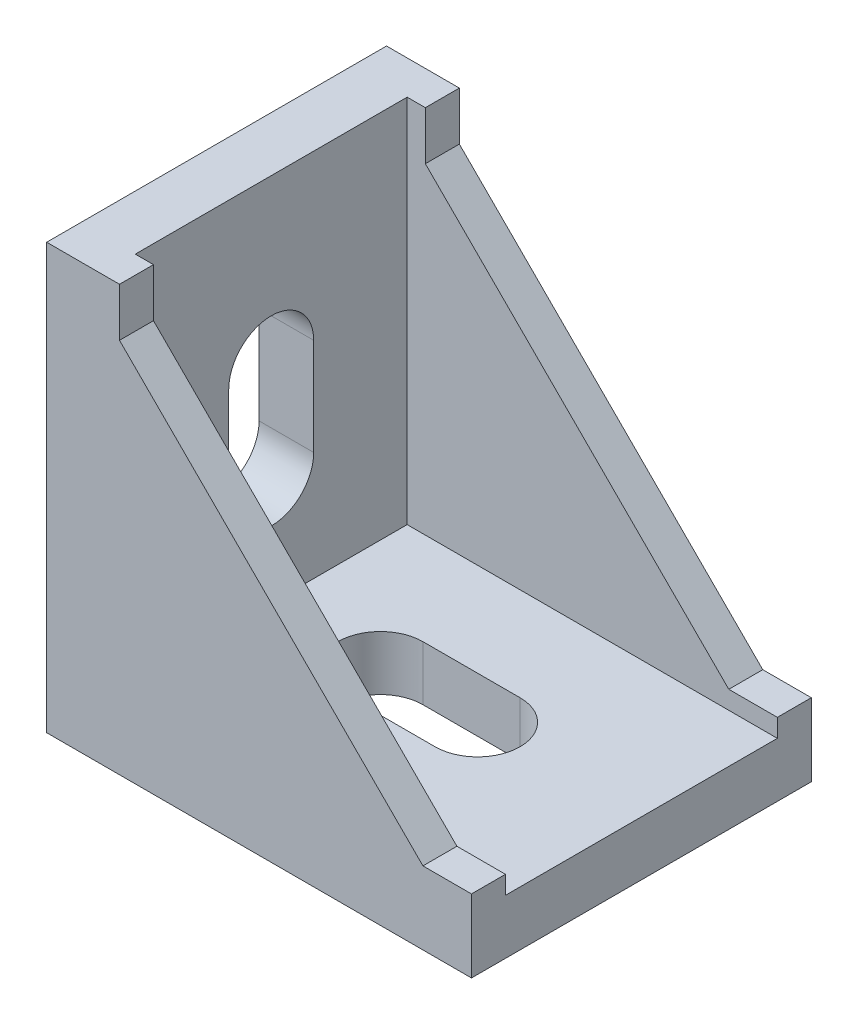
ISO-10303-21;
HEADER;
FILE_DESCRIPTION(('STEP AP214'),'2;1');
FILE_NAME('part.step','',(''),(''),'','','');
FILE_SCHEMA(('AUTOMOTIVE_DESIGN { 1 0 10303 214 1 1 1 1 }'));
ENDSEC;
DATA;
#1=APPLICATION_CONTEXT('core data for automotive mechanical design processes');
#2=APPLICATION_PROTOCOL_DEFINITION('international standard','automotive_design',2000,#1);
#3=PRODUCT_CONTEXT('',#1,'mechanical');
#4=PRODUCT('Part','Part','',(#3));
#5=PRODUCT_RELATED_PRODUCT_CATEGORY('part','',(#4));
#6=PRODUCT_DEFINITION_FORMATION('','',#4);
#7=PRODUCT_DEFINITION_CONTEXT('part definition',#1,'design');
#8=PRODUCT_DEFINITION('design','',#6,#7);
#9=PRODUCT_DEFINITION_SHAPE('','',#8);
#10=(LENGTH_UNIT() NAMED_UNIT(*) SI_UNIT(.MILLI.,.METRE.));
#11=(NAMED_UNIT(*) PLANE_ANGLE_UNIT() SI_UNIT($,.RADIAN.));
#12=(NAMED_UNIT(*) SI_UNIT($,.STERADIAN.) SOLID_ANGLE_UNIT());
#13=UNCERTAINTY_MEASURE_WITH_UNIT(LENGTH_MEASURE(1.E-05),#10,'distance_accuracy_value','');
#14=(GEOMETRIC_REPRESENTATION_CONTEXT(3) GLOBAL_UNCERTAINTY_ASSIGNED_CONTEXT((#13)) GLOBAL_UNIT_ASSIGNED_CONTEXT((#10,
#11,#12)) REPRESENTATION_CONTEXT('',''));
#15=CARTESIAN_POINT('',(0.,0.,0.));
#16=DIRECTION('',(0.,0.,1.));
#17=DIRECTION('',(1.,0.,0.));
#18=AXIS2_PLACEMENT_3D('',#15,#16,#17);
#19=CARTESIAN_POINT('',(13.5,0.,0.));
#20=DIRECTION('',(0.,1.,0.));
#21=DIRECTION('',(0.,0.,1.));
#22=AXIS2_PLACEMENT_3D('',#19,#20,#21);
#23=CYLINDRICAL_SURFACE('',#22,3.5);
#24=CARTESIAN_POINT('',(13.5,4.5,0.));
#25=DIRECTION('',(0.,-1.,0.));
#26=DIRECTION('',(0.,0.,1.));
#27=AXIS2_PLACEMENT_3D('',#24,#25,#26);
#28=CIRCLE('',#27,3.5);
#29=CARTESIAN_POINT('',(13.5,4.5,3.5));
#30=VERTEX_POINT('',#29);
#31=CARTESIAN_POINT('',(13.5,4.5,-3.5));
#32=VERTEX_POINT('',#31);
#33=EDGE_CURVE('E35',#30,#32,#28,.T.);
#34=ORIENTED_EDGE('',*,*,#33,.F.);
#35=DIRECTION('',(0.,1.,0.));
#36=VECTOR('',#35,1.);
#37=CARTESIAN_POINT('',(13.5,0.,3.5));
#38=LINE('',#37,#36);
#39=CARTESIAN_POINT('',(13.5,0.,3.5));
#40=VERTEX_POINT('',#39);
#41=EDGE_CURVE('E410',#40,#30,#38,.T.);
#42=ORIENTED_EDGE('',*,*,#41,.F.);
#43=CARTESIAN_POINT('',(13.5,0.,0.));
#44=DIRECTION('',(0.,1.,0.));
#45=DIRECTION('',(0.,0.,1.));
#46=AXIS2_PLACEMENT_3D('',#43,#44,#45);
#47=CIRCLE('',#46,3.5);
#48=CARTESIAN_POINT('',(13.5,0.,-3.5));
#49=VERTEX_POINT('',#48);
#50=EDGE_CURVE('E419',#49,#40,#47,.T.);
#51=ORIENTED_EDGE('',*,*,#50,.F.);
#52=DIRECTION('',(0.,1.,0.));
#53=VECTOR('',#52,1.);
#54=CARTESIAN_POINT('',(13.5,0.,-3.5));
#55=LINE('',#54,#53);
#56=EDGE_CURVE('E11',#49,#32,#55,.T.);
#57=ORIENTED_EDGE('',*,*,#56,.T.);
#58=EDGE_LOOP('',(#34,#42,#51,#57));
#59=FACE_BOUND('',#58,.T.);
#60=ADVANCED_FACE('F17',(#59),#23,.F.);
#61=CARTESIAN_POINT('',(21.5,0.,-3.5));
#62=DIRECTION('',(0.,0.,-1.));
#63=DIRECTION('',(0.707106781186548,0.707106781186548,0.));
#64=AXIS2_PLACEMENT_3D('',#61,#62,#63);
#65=PLANE('',#64);
#66=DIRECTION('',(1.,0.,0.));
#67=VECTOR('',#66,1.);
#68=CARTESIAN_POINT('',(28.25,4.5,-3.5));
#69=LINE('',#68,#67);
#70=CARTESIAN_POINT('',(21.5,4.5,-3.5));
#71=VERTEX_POINT('',#70);
#72=EDGE_CURVE('E305',#32,#71,#69,.T.);
#73=ORIENTED_EDGE('',*,*,#72,.F.);
#74=ORIENTED_EDGE('',*,*,#56,.F.);
#75=DIRECTION('',(-1.,0.,0.));
#76=VECTOR('',#75,1.);
#77=CARTESIAN_POINT('',(10.75,0.,-3.5));
#78=LINE('',#77,#76);
#79=CARTESIAN_POINT('',(21.5,0.,-3.5));
#80=VERTEX_POINT('',#79);
#81=EDGE_CURVE('E428',#80,#49,#78,.T.);
#82=ORIENTED_EDGE('',*,*,#81,.F.);
#83=DIRECTION('',(0.,1.,0.));
#84=VECTOR('',#83,1.);
#85=CARTESIAN_POINT('',(21.5,0.,-3.5));
#86=LINE('',#85,#84);
#87=EDGE_CURVE('E27',#80,#71,#86,.T.);
#88=ORIENTED_EDGE('',*,*,#87,.T.);
#89=EDGE_LOOP('',(#73,#74,#82,#88));
#90=FACE_BOUND('',#89,.T.);
#91=ADVANCED_FACE('F366',(#90),#65,.F.);
#92=CARTESIAN_POINT('',(21.5,0.,0.));
#93=DIRECTION('',(0.,1.,0.));
#94=DIRECTION('',(0.,0.,-1.));
#95=AXIS2_PLACEMENT_3D('',#92,#93,#94);
#96=CYLINDRICAL_SURFACE('',#95,3.5);
#97=CARTESIAN_POINT('',(21.5,4.5,0.));
#98=DIRECTION('',(0.,-1.,0.));
#99=DIRECTION('',(0.,0.,-1.));
#100=AXIS2_PLACEMENT_3D('',#97,#98,#99);
#101=CIRCLE('',#100,3.5);
#102=CARTESIAN_POINT('',(21.5,4.5,3.5));
#103=VERTEX_POINT('',#102);
#104=EDGE_CURVE('E293',#71,#103,#101,.T.);
#105=ORIENTED_EDGE('',*,*,#104,.F.);
#106=ORIENTED_EDGE('',*,*,#87,.F.);
#107=CARTESIAN_POINT('',(21.5,0.,0.));
#108=DIRECTION('',(0.,1.,0.));
#109=DIRECTION('',(0.,0.,-1.));
#110=AXIS2_PLACEMENT_3D('',#107,#108,#109);
#111=CIRCLE('',#110,3.5);
#112=CARTESIAN_POINT('',(21.5,0.,3.5));
#113=VERTEX_POINT('',#112);
#114=EDGE_CURVE('E295',#113,#80,#111,.T.);
#115=ORIENTED_EDGE('',*,*,#114,.F.);
#116=DIRECTION('',(0.,1.,0.));
#117=VECTOR('',#116,1.);
#118=CARTESIAN_POINT('',(21.5,0.,3.5));
#119=LINE('',#118,#117);
#120=EDGE_CURVE('E423',#113,#103,#119,.T.);
#121=ORIENTED_EDGE('',*,*,#120,.T.);
#122=EDGE_LOOP('',(#105,#106,#115,#121));
#123=FACE_BOUND('',#122,.T.);
#124=ADVANCED_FACE('F371',(#123),#96,.F.);
#125=CARTESIAN_POINT('',(13.5,0.,3.5));
#126=DIRECTION('',(0.,0.,1.));
#127=DIRECTION('',(0.707106781186548,0.707106781186548,0.));
#128=AXIS2_PLACEMENT_3D('',#125,#126,#127);
#129=PLANE('',#128);
#130=DIRECTION('',(-1.,0.,0.));
#131=VECTOR('',#130,1.);
#132=CARTESIAN_POINT('',(24.25,4.5,3.5));
#133=LINE('',#132,#131);
#134=EDGE_CURVE('E420',#103,#30,#133,.T.);
#135=ORIENTED_EDGE('',*,*,#134,.F.);
#136=ORIENTED_EDGE('',*,*,#120,.F.);
#137=DIRECTION('',(1.,0.,0.));
#138=VECTOR('',#137,1.);
#139=CARTESIAN_POINT('',(6.75,0.,3.5));
#140=LINE('',#139,#138);
#141=EDGE_CURVE('E189',#40,#113,#140,.T.);
#142=ORIENTED_EDGE('',*,*,#141,.F.);
#143=ORIENTED_EDGE('',*,*,#41,.T.);
#144=EDGE_LOOP('',(#135,#136,#142,#143));
#145=FACE_BOUND('',#144,.T.);
#146=ADVANCED_FACE('F377',(#145),#129,.F.);
#147=CARTESIAN_POINT('',(0.,21.5,0.));
#148=DIRECTION('',(1.,0.,0.));
#149=DIRECTION('',(0.,0.,1.));
#150=AXIS2_PLACEMENT_3D('',#147,#148,#149);
#151=CYLINDRICAL_SURFACE('',#150,3.5);
#152=CARTESIAN_POINT('',(4.5,21.5,0.));
#153=DIRECTION('',(-1.,0.,0.));
#154=DIRECTION('',(0.,0.,1.));
#155=AXIS2_PLACEMENT_3D('',#152,#153,#154);
#156=CIRCLE('',#155,3.5);
#157=CARTESIAN_POINT('',(4.5,21.5,3.5));
#158=VERTEX_POINT('',#157);
#159=CARTESIAN_POINT('',(4.5,21.5,-3.5));
#160=VERTEX_POINT('',#159);
#161=EDGE_CURVE('E261',#158,#160,#156,.T.);
#162=ORIENTED_EDGE('',*,*,#161,.F.);
#163=DIRECTION('',(1.,0.,0.));
#164=VECTOR('',#163,1.);
#165=CARTESIAN_POINT('',(0.,21.5,3.5));
#166=LINE('',#165,#164);
#167=CARTESIAN_POINT('',(0.,21.5,3.5));
#168=VERTEX_POINT('',#167);
#169=EDGE_CURVE('E257',#168,#158,#166,.T.);
#170=ORIENTED_EDGE('',*,*,#169,.F.);
#171=CARTESIAN_POINT('',(0.,21.5,0.));
#172=DIRECTION('',(1.,0.,0.));
#173=DIRECTION('',(0.,0.,1.));
#174=AXIS2_PLACEMENT_3D('',#171,#172,#173);
#175=CIRCLE('',#174,3.5);
#176=CARTESIAN_POINT('',(0.,21.5,-3.5));
#177=VERTEX_POINT('',#176);
#178=EDGE_CURVE('E247',#177,#168,#175,.T.);
#179=ORIENTED_EDGE('',*,*,#178,.F.);
#180=DIRECTION('',(1.,0.,0.));
#181=VECTOR('',#180,1.);
#182=CARTESIAN_POINT('',(0.,21.5,-3.5));
#183=LINE('',#182,#181);
#184=EDGE_CURVE('E409',#177,#160,#183,.T.);
#185=ORIENTED_EDGE('',*,*,#184,.T.);
#186=EDGE_LOOP('',(#162,#170,#179,#185));
#187=FACE_BOUND('',#186,.T.);
#188=ADVANCED_FACE('F381',(#187),#151,.F.);
#189=CARTESIAN_POINT('',(0.,13.5,-3.5));
#190=DIRECTION('',(0.,0.,-1.));
#191=DIRECTION('',(0.707106781186548,0.707106781186548,0.));
#192=AXIS2_PLACEMENT_3D('',#189,#190,#191);
#193=PLANE('',#192);
#194=DIRECTION('',(0.,-1.,0.));
#195=VECTOR('',#194,1.);
#196=CARTESIAN_POINT('',(4.5,9.,-3.5));
#197=LINE('',#196,#195);
#198=CARTESIAN_POINT('',(4.5,13.5,-3.5));
#199=VERTEX_POINT('',#198);
#200=EDGE_CURVE('E301',#160,#199,#197,.T.);
#201=ORIENTED_EDGE('',*,*,#200,.F.);
#202=ORIENTED_EDGE('',*,*,#184,.F.);
#203=DIRECTION('',(0.,1.,0.));
#204=VECTOR('',#203,1.);
#205=CARTESIAN_POINT('',(0.,24.25,-3.5));
#206=LINE('',#205,#204);
#207=CARTESIAN_POINT('',(0.,13.5,-3.5));
#208=VERTEX_POINT('',#207);
#209=EDGE_CURVE('E242',#208,#177,#206,.T.);
#210=ORIENTED_EDGE('',*,*,#209,.F.);
#211=DIRECTION('',(1.,0.,0.));
#212=VECTOR('',#211,1.);
#213=CARTESIAN_POINT('',(0.,13.5,-3.5));
#214=LINE('',#213,#212);
#215=EDGE_CURVE('E256',#208,#199,#214,.T.);
#216=ORIENTED_EDGE('',*,*,#215,.T.);
#217=EDGE_LOOP('',(#201,#202,#210,#216));
#218=FACE_BOUND('',#217,.T.);
#219=ADVANCED_FACE('F385',(#218),#193,.F.);
#220=CARTESIAN_POINT('',(0.,13.5,0.));
#221=DIRECTION('',(1.,0.,0.));
#222=DIRECTION('',(0.,0.,-1.));
#223=AXIS2_PLACEMENT_3D('',#220,#221,#222);
#224=CYLINDRICAL_SURFACE('',#223,3.5);
#225=CARTESIAN_POINT('',(4.5,13.5,0.));
#226=DIRECTION('',(-1.,0.,0.));
#227=DIRECTION('',(0.,0.,-1.));
#228=AXIS2_PLACEMENT_3D('',#225,#226,#227);
#229=CIRCLE('',#228,3.5);
#230=CARTESIAN_POINT('',(4.5,13.5,3.5));
#231=VERTEX_POINT('',#230);
#232=EDGE_CURVE('E251',#199,#231,#229,.T.);
#233=ORIENTED_EDGE('',*,*,#232,.F.);
#234=ORIENTED_EDGE('',*,*,#215,.F.);
#235=CARTESIAN_POINT('',(0.,13.5,0.));
#236=DIRECTION('',(1.,0.,0.));
#237=DIRECTION('',(0.,0.,-1.));
#238=AXIS2_PLACEMENT_3D('',#235,#236,#237);
#239=CIRCLE('',#238,3.5);
#240=CARTESIAN_POINT('',(0.,13.5,3.5));
#241=VERTEX_POINT('',#240);
#242=EDGE_CURVE('E238',#241,#208,#239,.T.);
#243=ORIENTED_EDGE('',*,*,#242,.F.);
#244=DIRECTION('',(1.,0.,0.));
#245=VECTOR('',#244,1.);
#246=CARTESIAN_POINT('',(0.,13.5,3.5));
#247=LINE('',#246,#245);
#248=EDGE_CURVE('E253',#241,#231,#247,.T.);
#249=ORIENTED_EDGE('',*,*,#248,.T.);
#250=EDGE_LOOP('',(#233,#234,#243,#249));
#251=FACE_BOUND('',#250,.T.);
#252=ADVANCED_FACE('F389',(#251),#224,.F.);
#253=CARTESIAN_POINT('',(0.,21.5,3.5));
#254=DIRECTION('',(0.,0.,1.));
#255=DIRECTION('',(0.707106781186548,0.707106781186548,0.));
#256=AXIS2_PLACEMENT_3D('',#253,#254,#255);
#257=PLANE('',#256);
#258=DIRECTION('',(0.,1.,0.));
#259=VECTOR('',#258,1.);
#260=CARTESIAN_POINT('',(4.5,13.,3.5));
#261=LINE('',#260,#259);
#262=EDGE_CURVE('E258',#231,#158,#261,.T.);
#263=ORIENTED_EDGE('',*,*,#262,.F.);
#264=ORIENTED_EDGE('',*,*,#248,.F.);
#265=DIRECTION('',(0.,-1.,0.));
#266=VECTOR('',#265,1.);
#267=CARTESIAN_POINT('',(0.,28.25,3.5));
#268=LINE('',#267,#266);
#269=EDGE_CURVE('E201',#168,#241,#268,.T.);
#270=ORIENTED_EDGE('',*,*,#269,.F.);
#271=ORIENTED_EDGE('',*,*,#169,.T.);
#272=EDGE_LOOP('',(#263,#264,#270,#271));
#273=FACE_BOUND('',#272,.T.);
#274=ADVANCED_FACE('F363',(#273),#257,.F.);
#275=CARTESIAN_POINT('',(31.,6.,-14.));
#276=DIRECTION('',(0.,1.,0.));
#277=DIRECTION('',(0.707106781186548,0.,0.707106781186548));
#278=AXIS2_PLACEMENT_3D('',#275,#276,#277);
#279=PLANE('',#278);
#280=DIRECTION('',(-1.,0.,0.));
#281=VECTOR('',#280,1.);
#282=CARTESIAN_POINT('',(35.,6.,-14.));
#283=LINE('',#282,#281);
#284=CARTESIAN_POINT('',(35.,6.,-14.));
#285=VERTEX_POINT('',#284);
#286=CARTESIAN_POINT('',(31.,6.,-14.));
#287=VERTEX_POINT('',#286);
#288=EDGE_CURVE('E263',#285,#287,#283,.T.);
#289=ORIENTED_EDGE('',*,*,#288,.T.);
#290=DIRECTION('',(0.,0.,1.));
#291=VECTOR('',#290,1.);
#292=CARTESIAN_POINT('',(31.,6.,-14.));
#293=LINE('',#292,#291);
#294=CARTESIAN_POINT('',(31.,6.,-11.2));
#295=VERTEX_POINT('',#294);
#296=EDGE_CURVE('E266',#287,#295,#293,.T.);
#297=ORIENTED_EDGE('',*,*,#296,.T.);
#298=DIRECTION('',(1.,0.,0.));
#299=VECTOR('',#298,1.);
#300=CARTESIAN_POINT('',(35.,6.,-11.2));
#301=LINE('',#300,#299);
#302=CARTESIAN_POINT('',(35.,6.,-11.2));
#303=VERTEX_POINT('',#302);
#304=EDGE_CURVE('E269',#295,#303,#301,.T.);
#305=ORIENTED_EDGE('',*,*,#304,.T.);
#306=DIRECTION('',(0.,0.,1.));
#307=VECTOR('',#306,1.);
#308=CARTESIAN_POINT('',(35.,6.,-14.));
#309=LINE('',#308,#307);
#310=EDGE_CURVE('E273',#285,#303,#309,.T.);
#311=ORIENTED_EDGE('',*,*,#310,.F.);
#312=EDGE_LOOP('',(#289,#297,#305,#311));
#313=FACE_BOUND('',#312,.T.);
#314=ADVANCED_FACE('F341',(#313),#279,.T.);
#315=CARTESIAN_POINT('',(6.,31.,-14.));
#316=DIRECTION('',(0.707106781186547,0.707106781186548,0.));
#317=DIRECTION('',(-0.577350269189626,0.577350269189626,0.577350269189626));
#318=AXIS2_PLACEMENT_3D('',#315,#316,#317);
#319=PLANE('',#318);
#320=DIRECTION('',(-0.707106781186548,0.707106781186547,0.));
#321=VECTOR('',#320,1.);
#322=CARTESIAN_POINT('',(31.,6.,-14.));
#323=LINE('',#322,#321);
#324=CARTESIAN_POINT('',(6.,31.,-14.));
#325=VERTEX_POINT('',#324);
#326=EDGE_CURVE('E272',#287,#325,#323,.T.);
#327=ORIENTED_EDGE('',*,*,#326,.T.);
#328=DIRECTION('',(0.,0.,1.));
#329=VECTOR('',#328,1.);
#330=CARTESIAN_POINT('',(6.,31.,-14.));
#331=LINE('',#330,#329);
#332=CARTESIAN_POINT('',(6.,31.,-11.2));
#333=VERTEX_POINT('',#332);
#334=EDGE_CURVE('E278',#325,#333,#331,.T.);
#335=ORIENTED_EDGE('',*,*,#334,.T.);
#336=DIRECTION('',(0.707106781186548,-0.707106781186547,0.));
#337=VECTOR('',#336,1.);
#338=CARTESIAN_POINT('',(31.,6.,-11.2));
#339=LINE('',#338,#337);
#340=EDGE_CURVE('E281',#333,#295,#339,.T.);
#341=ORIENTED_EDGE('',*,*,#340,.T.);
#342=ORIENTED_EDGE('',*,*,#296,.F.);
#343=EDGE_LOOP('',(#327,#335,#341,#342));
#344=FACE_BOUND('',#343,.T.);
#345=ADVANCED_FACE('F354',(#344),#319,.T.);
#346=CARTESIAN_POINT('',(6.,35.,-14.));
#347=DIRECTION('',(1.,0.,0.));
#348=DIRECTION('',(0.,0.707106781186548,0.707106781186548));
#349=AXIS2_PLACEMENT_3D('',#346,#347,#348);
#350=PLANE('',#349);
#351=DIRECTION('',(0.,1.,0.));
#352=VECTOR('',#351,1.);
#353=CARTESIAN_POINT('',(6.,31.,-14.));
#354=LINE('',#353,#352);
#355=CARTESIAN_POINT('',(6.,35.,-14.));
#356=VERTEX_POINT('',#355);
#357=EDGE_CURVE('E284',#325,#356,#354,.T.);
#358=ORIENTED_EDGE('',*,*,#357,.T.);
#359=DIRECTION('',(0.,0.,1.));
#360=VECTOR('',#359,1.);
#361=CARTESIAN_POINT('',(6.,35.,-14.));
#362=LINE('',#361,#360);
#363=CARTESIAN_POINT('',(6.,35.,-11.2));
#364=VERTEX_POINT('',#363);
#365=EDGE_CURVE('E287',#356,#364,#362,.T.);
#366=ORIENTED_EDGE('',*,*,#365,.T.);
#367=DIRECTION('',(0.,-1.,0.));
#368=VECTOR('',#367,1.);
#369=CARTESIAN_POINT('',(6.,31.,-11.2));
#370=LINE('',#369,#368);
#371=EDGE_CURVE('E290',#364,#333,#370,.T.);
#372=ORIENTED_EDGE('',*,*,#371,.T.);
#373=ORIENTED_EDGE('',*,*,#334,.F.);
#374=EDGE_LOOP('',(#358,#366,#372,#373));
#375=FACE_BOUND('',#374,.T.);
#376=ADVANCED_FACE('F352',(#375),#350,.T.);
#377=CARTESIAN_POINT('',(14.9976124774548,14.9976124774548,-11.2));
#378=DIRECTION('',(0.,0.,1.));
#379=DIRECTION('',(0.707106781186548,0.707106781186548,0.));
#380=AXIS2_PLACEMENT_3D('',#377,#378,#379);
#381=PLANE('',#380);
#382=DIRECTION('',(0.,-1.,0.));
#383=VECTOR('',#382,1.);
#384=CARTESIAN_POINT('',(35.,4.5,-11.2));
#385=LINE('',#384,#383);
#386=CARTESIAN_POINT('',(35.,4.5,-11.2));
#387=VERTEX_POINT('',#386);
#388=EDGE_CURVE('E275',#303,#387,#385,.T.);
#389=ORIENTED_EDGE('',*,*,#388,.F.);
#390=ORIENTED_EDGE('',*,*,#304,.F.);
#391=ORIENTED_EDGE('',*,*,#340,.F.);
#392=ORIENTED_EDGE('',*,*,#371,.F.);
#393=DIRECTION('',(1.,0.,0.));
#394=VECTOR('',#393,1.);
#395=CARTESIAN_POINT('',(6.,35.,-11.2));
#396=LINE('',#395,#394);
#397=CARTESIAN_POINT('',(4.5,35.,-11.2));
#398=VERTEX_POINT('',#397);
#399=EDGE_CURVE('E220',#398,#364,#396,.T.);
#400=ORIENTED_EDGE('',*,*,#399,.F.);
#401=DIRECTION('',(0.,1.,0.));
#402=VECTOR('',#401,1.);
#403=CARTESIAN_POINT('',(4.5,9.74880623872738,-11.2));
#404=LINE('',#403,#402);
#405=CARTESIAN_POINT('',(4.5,4.5,-11.2));
#406=VERTEX_POINT('',#405);
#407=EDGE_CURVE('E232',#406,#398,#404,.T.);
#408=ORIENTED_EDGE('',*,*,#407,.F.);
#409=DIRECTION('',(-1.,0.,0.));
#410=VECTOR('',#409,1.);
#411=CARTESIAN_POINT('',(24.9988062387274,4.5,-11.2));
#412=LINE('',#411,#410);
#413=EDGE_CURVE('E302',#387,#406,#412,.T.);
#414=ORIENTED_EDGE('',*,*,#413,.F.);
#415=EDGE_LOOP('',(#389,#390,#391,#392,#400,#408,#414));
#416=FACE_BOUND('',#415,.T.);
#417=ADVANCED_FACE('F343',(#416),#381,.T.);
#418=CARTESIAN_POINT('',(35.,4.5,0.));
#419=DIRECTION('',(0.,1.,0.));
#420=DIRECTION('',(0.707106781186548,0.,0.707106781186548));
#421=AXIS2_PLACEMENT_3D('',#418,#419,#420);
#422=PLANE('',#421);
#423=ORIENTED_EDGE('',*,*,#104,.T.);
#424=ORIENTED_EDGE('',*,*,#134,.T.);
#425=ORIENTED_EDGE('',*,*,#33,.T.);
#426=ORIENTED_EDGE('',*,*,#72,.T.);
#427=EDGE_LOOP('',(#423,#424,#425,#426));
#428=FACE_BOUND('',#427,.T.);
#429=ORIENTED_EDGE('',*,*,#413,.T.);
#430=DIRECTION('',(0.,0.,1.));
#431=VECTOR('',#430,1.);
#432=CARTESIAN_POINT('',(4.5,4.5,0.));
#433=LINE('',#432,#431);
#434=CARTESIAN_POINT('',(4.5,4.5,11.2));
#435=VERTEX_POINT('',#434);
#436=EDGE_CURVE('E306',#406,#435,#433,.T.);
#437=ORIENTED_EDGE('',*,*,#436,.T.);
#438=DIRECTION('',(1.,0.,0.));
#439=VECTOR('',#438,1.);
#440=CARTESIAN_POINT('',(24.9988062387274,4.5,11.2));
#441=LINE('',#440,#439);
#442=CARTESIAN_POINT('',(35.,4.5,11.2));
#443=VERTEX_POINT('',#442);
#444=EDGE_CURVE('E309',#435,#443,#441,.T.);
#445=ORIENTED_EDGE('',*,*,#444,.T.);
#446=DIRECTION('',(0.,0.,1.));
#447=VECTOR('',#446,1.);
#448=CARTESIAN_POINT('',(35.,4.5,0.));
#449=LINE('',#448,#447);
#450=EDGE_CURVE('E298',#387,#443,#449,.T.);
#451=ORIENTED_EDGE('',*,*,#450,.F.);
#452=EDGE_LOOP('',(#429,#437,#445,#451));
#453=FACE_BOUND('',#452,.T.);
#454=ADVANCED_FACE('F347',(#428,#453),#422,.T.);
#455=CARTESIAN_POINT('',(31.,6.,14.));
#456=DIRECTION('',(0.,1.,0.));
#457=DIRECTION('',(0.707106781186548,0.,0.707106781186548));
#458=AXIS2_PLACEMENT_3D('',#455,#456,#457);
#459=PLANE('',#458);
#460=DIRECTION('',(-1.,0.,0.));
#461=VECTOR('',#460,1.);
#462=CARTESIAN_POINT('',(35.,6.,14.));
#463=LINE('',#462,#461);
#464=CARTESIAN_POINT('',(35.,6.,14.));
#465=VERTEX_POINT('',#464);
#466=CARTESIAN_POINT('',(31.,6.,14.));
#467=VERTEX_POINT('',#466);
#468=EDGE_CURVE('E180',#465,#467,#463,.T.);
#469=ORIENTED_EDGE('',*,*,#468,.F.);
#470=DIRECTION('',(0.,0.,-1.));
#471=VECTOR('',#470,1.);
#472=CARTESIAN_POINT('',(35.,6.,14.));
#473=LINE('',#472,#471);
#474=CARTESIAN_POINT('',(35.,6.,11.2));
#475=VERTEX_POINT('',#474);
#476=EDGE_CURVE('E177',#465,#475,#473,.T.);
#477=ORIENTED_EDGE('',*,*,#476,.T.);
#478=DIRECTION('',(1.,0.,0.));
#479=VECTOR('',#478,1.);
#480=CARTESIAN_POINT('',(35.,6.,11.2));
#481=LINE('',#480,#479);
#482=CARTESIAN_POINT('',(31.,6.,11.2));
#483=VERTEX_POINT('',#482);
#484=EDGE_CURVE('E316',#483,#475,#481,.T.);
#485=ORIENTED_EDGE('',*,*,#484,.F.);
#486=DIRECTION('',(0.,0.,-1.));
#487=VECTOR('',#486,1.);
#488=CARTESIAN_POINT('',(31.,6.,14.));
#489=LINE('',#488,#487);
#490=EDGE_CURVE('E315',#467,#483,#489,.T.);
#491=ORIENTED_EDGE('',*,*,#490,.F.);
#492=EDGE_LOOP('',(#469,#477,#485,#491));
#493=FACE_BOUND('',#492,.T.);
#494=ADVANCED_FACE('F467',(#493),#459,.T.);
#495=CARTESIAN_POINT('',(6.,31.,14.));
#496=DIRECTION('',(0.707106781186547,0.707106781186548,0.));
#497=DIRECTION('',(-0.577350269189626,0.577350269189626,0.577350269189626));
#498=AXIS2_PLACEMENT_3D('',#495,#496,#497);
#499=PLANE('',#498);
#500=DIRECTION('',(-0.707106781186548,0.707106781186547,0.));
#501=VECTOR('',#500,1.);
#502=CARTESIAN_POINT('',(31.,6.,14.));
#503=LINE('',#502,#501);
#504=CARTESIAN_POINT('',(6.,31.,14.));
#505=VERTEX_POINT('',#504);
#506=EDGE_CURVE('E205',#467,#505,#503,.T.);
#507=ORIENTED_EDGE('',*,*,#506,.F.);
#508=ORIENTED_EDGE('',*,*,#490,.T.);
#509=DIRECTION('',(0.707106781186548,-0.707106781186547,0.));
#510=VECTOR('',#509,1.);
#511=CARTESIAN_POINT('',(31.,6.,11.2));
#512=LINE('',#511,#510);
#513=CARTESIAN_POINT('',(6.,31.,11.2));
#514=VERTEX_POINT('',#513);
#515=EDGE_CURVE('E218',#514,#483,#512,.T.);
#516=ORIENTED_EDGE('',*,*,#515,.F.);
#517=DIRECTION('',(0.,0.,-1.));
#518=VECTOR('',#517,1.);
#519=CARTESIAN_POINT('',(6.,31.,14.));
#520=LINE('',#519,#518);
#521=EDGE_CURVE('E212',#505,#514,#520,.T.);
#522=ORIENTED_EDGE('',*,*,#521,.F.);
#523=EDGE_LOOP('',(#507,#508,#516,#522));
#524=FACE_BOUND('',#523,.T.);
#525=ADVANCED_FACE('F327',(#524),#499,.T.);
#526=CARTESIAN_POINT('',(6.,35.,14.));
#527=DIRECTION('',(1.,0.,0.));
#528=DIRECTION('',(0.,0.707106781186548,0.707106781186548));
#529=AXIS2_PLACEMENT_3D('',#526,#527,#528);
#530=PLANE('',#529);
#531=DIRECTION('',(0.,1.,0.));
#532=VECTOR('',#531,1.);
#533=CARTESIAN_POINT('',(6.,31.,14.));
#534=LINE('',#533,#532);
#535=CARTESIAN_POINT('',(6.,35.,14.));
#536=VERTEX_POINT('',#535);
#537=EDGE_CURVE('E203',#505,#536,#534,.T.);
#538=ORIENTED_EDGE('',*,*,#537,.F.);
#539=ORIENTED_EDGE('',*,*,#521,.T.);
#540=DIRECTION('',(0.,-1.,0.));
#541=VECTOR('',#540,1.);
#542=CARTESIAN_POINT('',(6.,31.,11.2));
#543=LINE('',#542,#541);
#544=CARTESIAN_POINT('',(6.,35.,11.2));
#545=VERTEX_POINT('',#544);
#546=EDGE_CURVE('E214',#545,#514,#543,.T.);
#547=ORIENTED_EDGE('',*,*,#546,.F.);
#548=DIRECTION('',(0.,0.,-1.));
#549=VECTOR('',#548,1.);
#550=CARTESIAN_POINT('',(6.,35.,14.));
#551=LINE('',#550,#549);
#552=EDGE_CURVE('E202',#536,#545,#551,.T.);
#553=ORIENTED_EDGE('',*,*,#552,.F.);
#554=EDGE_LOOP('',(#538,#539,#547,#553));
#555=FACE_BOUND('',#554,.T.);
#556=ADVANCED_FACE('F330',(#555),#530,.T.);
#557=CARTESIAN_POINT('',(14.9976124774548,14.9976124774548,11.2));
#558=DIRECTION('',(0.,0.,-1.));
#559=DIRECTION('',(0.707106781186548,0.707106781186548,0.));
#560=AXIS2_PLACEMENT_3D('',#557,#558,#559);
#561=PLANE('',#560);
#562=DIRECTION('',(0.,-1.,0.));
#563=VECTOR('',#562,1.);
#564=CARTESIAN_POINT('',(35.,4.5,11.2));
#565=LINE('',#564,#563);
#566=EDGE_CURVE('E221',#475,#443,#565,.T.);
#567=ORIENTED_EDGE('',*,*,#566,.T.);
#568=ORIENTED_EDGE('',*,*,#444,.F.);
#569=DIRECTION('',(0.,-1.,0.));
#570=VECTOR('',#569,1.);
#571=CARTESIAN_POINT('',(4.5,9.74880623872738,11.2));
#572=LINE('',#571,#570);
#573=CARTESIAN_POINT('',(4.5,35.,11.2));
#574=VERTEX_POINT('',#573);
#575=EDGE_CURVE('E224',#574,#435,#572,.T.);
#576=ORIENTED_EDGE('',*,*,#575,.F.);
#577=DIRECTION('',(1.,0.,0.));
#578=VECTOR('',#577,1.);
#579=CARTESIAN_POINT('',(6.,35.,11.2));
#580=LINE('',#579,#578);
#581=EDGE_CURVE('E217',#574,#545,#580,.T.);
#582=ORIENTED_EDGE('',*,*,#581,.T.);
#583=ORIENTED_EDGE('',*,*,#546,.T.);
#584=ORIENTED_EDGE('',*,*,#515,.T.);
#585=ORIENTED_EDGE('',*,*,#484,.T.);
#586=EDGE_LOOP('',(#567,#568,#576,#582,#583,#584,#585));
#587=FACE_BOUND('',#586,.T.);
#588=ADVANCED_FACE('F321',(#587),#561,.T.);
#589=CARTESIAN_POINT('',(4.5,4.5,0.));
#590=DIRECTION('',(1.,0.,0.));
#591=DIRECTION('',(0.,0.707106781186548,0.707106781186548));
#592=AXIS2_PLACEMENT_3D('',#589,#590,#591);
#593=PLANE('',#592);
#594=ORIENTED_EDGE('',*,*,#232,.T.);
#595=ORIENTED_EDGE('',*,*,#262,.T.);
#596=ORIENTED_EDGE('',*,*,#161,.T.);
#597=ORIENTED_EDGE('',*,*,#200,.T.);
#598=EDGE_LOOP('',(#594,#595,#596,#597));
#599=FACE_BOUND('',#598,.T.);
#600=ORIENTED_EDGE('',*,*,#407,.T.);
#601=DIRECTION('',(0.,0.,1.));
#602=VECTOR('',#601,1.);
#603=CARTESIAN_POINT('',(4.5,35.,0.));
#604=LINE('',#603,#602);
#605=EDGE_CURVE('E227',#398,#574,#604,.T.);
#606=ORIENTED_EDGE('',*,*,#605,.T.);
#607=ORIENTED_EDGE('',*,*,#575,.T.);
#608=ORIENTED_EDGE('',*,*,#436,.F.);
#609=EDGE_LOOP('',(#600,#606,#607,#608));
#610=FACE_BOUND('',#609,.T.);
#611=ADVANCED_FACE('F349',(#599,#610),#593,.T.);
#612=CARTESIAN_POINT('',(10.8553571428571,10.8553571428571,-14.));
#613=DIRECTION('',(0.,0.,-1.));
#614=DIRECTION('',(0.707106781186548,0.707106781186548,0.));
#615=AXIS2_PLACEMENT_3D('',#612,#613,#614);
#616=PLANE('',#615);
#617=DIRECTION('',(-1.,0.,0.));
#618=VECTOR('',#617,1.);
#619=CARTESIAN_POINT('',(0.,0.,-14.));
#620=LINE('',#619,#618);
#621=CARTESIAN_POINT('',(35.,0.,-14.));
#622=VERTEX_POINT('',#621);
#623=CARTESIAN_POINT('',(0.,0.,-14.));
#624=VERTEX_POINT('',#623);
#625=EDGE_CURVE('E188',#622,#624,#620,.T.);
#626=ORIENTED_EDGE('',*,*,#625,.T.);
#627=DIRECTION('',(0.,1.,0.));
#628=VECTOR('',#627,1.);
#629=CARTESIAN_POINT('',(0.,35.,-14.));
#630=LINE('',#629,#628);
#631=CARTESIAN_POINT('',(0.,35.,-14.));
#632=VERTEX_POINT('',#631);
#633=EDGE_CURVE('E234',#624,#632,#630,.T.);
#634=ORIENTED_EDGE('',*,*,#633,.T.);
#635=DIRECTION('',(1.,0.,0.));
#636=VECTOR('',#635,1.);
#637=CARTESIAN_POINT('',(4.5,35.,-14.));
#638=LINE('',#637,#636);
#639=EDGE_CURVE('E236',#632,#356,#638,.T.);
#640=ORIENTED_EDGE('',*,*,#639,.T.);
#641=ORIENTED_EDGE('',*,*,#357,.F.);
#642=ORIENTED_EDGE('',*,*,#326,.F.);
#643=ORIENTED_EDGE('',*,*,#288,.F.);
#644=DIRECTION('',(0.,1.,0.));
#645=VECTOR('',#644,1.);
#646=CARTESIAN_POINT('',(35.,4.5,-14.));
#647=LINE('',#646,#645);
#648=EDGE_CURVE('E195',#622,#285,#647,.T.);
#649=ORIENTED_EDGE('',*,*,#648,.F.);
#650=EDGE_LOOP('',(#626,#634,#640,#641,#642,#643,#649));
#651=FACE_BOUND('',#650,.T.);
#652=ADVANCED_FACE('F335',(#651),#616,.T.);
#653=CARTESIAN_POINT('',(0.,35.,0.));
#654=DIRECTION('',(-1.,0.,0.));
#655=DIRECTION('',(0.,0.707106781186548,0.707106781186548));
#656=AXIS2_PLACEMENT_3D('',#653,#654,#655);
#657=PLANE('',#656);
#658=ORIENTED_EDGE('',*,*,#242,.T.);
#659=ORIENTED_EDGE('',*,*,#209,.T.);
#660=ORIENTED_EDGE('',*,*,#178,.T.);
#661=ORIENTED_EDGE('',*,*,#269,.T.);
#662=EDGE_LOOP('',(#658,#659,#660,#661));
#663=FACE_BOUND('',#662,.T.);
#664=DIRECTION('',(0.,0.,-1.));
#665=VECTOR('',#664,1.);
#666=CARTESIAN_POINT('',(0.,0.,0.));
#667=LINE('',#666,#665);
#668=CARTESIAN_POINT('',(0.,0.,14.));
#669=VERTEX_POINT('',#668);
#670=EDGE_CURVE('E190',#669,#624,#667,.T.);
#671=ORIENTED_EDGE('',*,*,#670,.F.);
#672=DIRECTION('',(0.,-1.,0.));
#673=VECTOR('',#672,1.);
#674=CARTESIAN_POINT('',(0.,35.,14.));
#675=LINE('',#674,#673);
#676=CARTESIAN_POINT('',(0.,35.,14.));
#677=VERTEX_POINT('',#676);
#678=EDGE_CURVE('E163',#677,#669,#675,.T.);
#679=ORIENTED_EDGE('',*,*,#678,.F.);
#680=DIRECTION('',(0.,0.,1.));
#681=VECTOR('',#680,1.);
#682=CARTESIAN_POINT('',(0.,35.,0.));
#683=LINE('',#682,#681);
#684=EDGE_CURVE('E199',#632,#677,#683,.T.);
#685=ORIENTED_EDGE('',*,*,#684,.F.);
#686=ORIENTED_EDGE('',*,*,#633,.F.);
#687=EDGE_LOOP('',(#671,#679,#685,#686));
#688=FACE_BOUND('',#687,.T.);
#689=ADVANCED_FACE('F334',(#663,#688),#657,.T.);
#690=CARTESIAN_POINT('',(4.5,35.,0.));
#691=DIRECTION('',(0.,1.,0.));
#692=DIRECTION('',(0.707106781186548,0.,0.707106781186548));
#693=AXIS2_PLACEMENT_3D('',#690,#691,#692);
#694=PLANE('',#693);
#695=ORIENTED_EDGE('',*,*,#684,.T.);
#696=DIRECTION('',(-1.,0.,0.));
#697=VECTOR('',#696,1.);
#698=CARTESIAN_POINT('',(6.,35.,14.));
#699=LINE('',#698,#697);
#700=EDGE_CURVE('E198',#536,#677,#699,.T.);
#701=ORIENTED_EDGE('',*,*,#700,.F.);
#702=ORIENTED_EDGE('',*,*,#552,.T.);
#703=ORIENTED_EDGE('',*,*,#581,.F.);
#704=ORIENTED_EDGE('',*,*,#605,.F.);
#705=ORIENTED_EDGE('',*,*,#399,.T.);
#706=ORIENTED_EDGE('',*,*,#365,.F.);
#707=ORIENTED_EDGE('',*,*,#639,.F.);
#708=EDGE_LOOP('',(#695,#701,#702,#703,#704,#705,#706,#707));
#709=FACE_BOUND('',#708,.T.);
#710=ADVANCED_FACE('F333',(#709),#694,.T.);
#711=CARTESIAN_POINT('',(35.,0.,0.));
#712=DIRECTION('',(1.,0.,0.));
#713=DIRECTION('',(0.,0.707106781186548,0.707106781186548));
#714=AXIS2_PLACEMENT_3D('',#711,#712,#713);
#715=PLANE('',#714);
#716=ORIENTED_EDGE('',*,*,#450,.T.);
#717=ORIENTED_EDGE('',*,*,#566,.F.);
#718=ORIENTED_EDGE('',*,*,#476,.F.);
#719=DIRECTION('',(0.,1.,0.));
#720=VECTOR('',#719,1.);
#721=CARTESIAN_POINT('',(35.,0.,14.));
#722=LINE('',#721,#720);
#723=CARTESIAN_POINT('',(35.,0.,14.));
#724=VERTEX_POINT('',#723);
#725=EDGE_CURVE('E170',#724,#465,#722,.T.);
#726=ORIENTED_EDGE('',*,*,#725,.F.);
#727=DIRECTION('',(0.,0.,1.));
#728=VECTOR('',#727,1.);
#729=CARTESIAN_POINT('',(35.,0.,0.));
#730=LINE('',#729,#728);
#731=EDGE_CURVE('E174',#622,#724,#730,.T.);
#732=ORIENTED_EDGE('',*,*,#731,.F.);
#733=ORIENTED_EDGE('',*,*,#648,.T.);
#734=ORIENTED_EDGE('',*,*,#310,.T.);
#735=ORIENTED_EDGE('',*,*,#388,.T.);
#736=EDGE_LOOP('',(#716,#717,#718,#726,#732,#733,#734,#735));
#737=FACE_BOUND('',#736,.T.);
#738=ADVANCED_FACE('F172',(#737),#715,.T.);
#739=CARTESIAN_POINT('',(0.,0.,0.));
#740=DIRECTION('',(0.,-1.,0.));
#741=DIRECTION('',(0.707106781186548,0.,0.707106781186548));
#742=AXIS2_PLACEMENT_3D('',#739,#740,#741);
#743=PLANE('',#742);
#744=ORIENTED_EDGE('',*,*,#114,.T.);
#745=ORIENTED_EDGE('',*,*,#81,.T.);
#746=ORIENTED_EDGE('',*,*,#50,.T.);
#747=ORIENTED_EDGE('',*,*,#141,.T.);
#748=EDGE_LOOP('',(#744,#745,#746,#747));
#749=FACE_BOUND('',#748,.T.);
#750=ORIENTED_EDGE('',*,*,#731,.T.);
#751=DIRECTION('',(1.,0.,0.));
#752=VECTOR('',#751,1.);
#753=CARTESIAN_POINT('',(0.,0.,14.));
#754=LINE('',#753,#752);
#755=EDGE_CURVE('E21',#669,#724,#754,.T.);
#756=ORIENTED_EDGE('',*,*,#755,.F.);
#757=ORIENTED_EDGE('',*,*,#670,.T.);
#758=ORIENTED_EDGE('',*,*,#625,.F.);
#759=EDGE_LOOP('',(#750,#756,#757,#758));
#760=FACE_BOUND('',#759,.T.);
#761=ADVANCED_FACE('F185',(#749,#760),#743,.T.);
#762=CARTESIAN_POINT('',(10.8553571428571,10.8553571428571,14.));
#763=DIRECTION('',(0.,0.,1.));
#764=DIRECTION('',(0.707106781186548,0.707106781186548,0.));
#765=AXIS2_PLACEMENT_3D('',#762,#763,#764);
#766=PLANE('',#765);
#767=ORIENTED_EDGE('',*,*,#755,.T.);
#768=ORIENTED_EDGE('',*,*,#725,.T.);
#769=ORIENTED_EDGE('',*,*,#468,.T.);
#770=ORIENTED_EDGE('',*,*,#506,.T.);
#771=ORIENTED_EDGE('',*,*,#537,.T.);
#772=ORIENTED_EDGE('',*,*,#700,.T.);
#773=ORIENTED_EDGE('',*,*,#678,.T.);
#774=EDGE_LOOP('',(#767,#768,#769,#770,#771,#772,#773));
#775=FACE_BOUND('',#774,.T.);
#776=ADVANCED_FACE('F19',(#775),#766,.T.);
#777=CLOSED_SHELL('',(#60,#91,#124,#146,#188,#219,#252,#274,#314,#345,#376,#417,#454,#494,#525,
#556,#588,#611,#652,#689,#710,#738,#761,#776));
#778=MANIFOLD_SOLID_BREP('B1',#777);
#779=ADVANCED_BREP_SHAPE_REPRESENTATION('',(#18,#778),#14);
#780=SHAPE_DEFINITION_REPRESENTATION(#9,#779);
ENDSEC;
END-ISO-10303-21;
